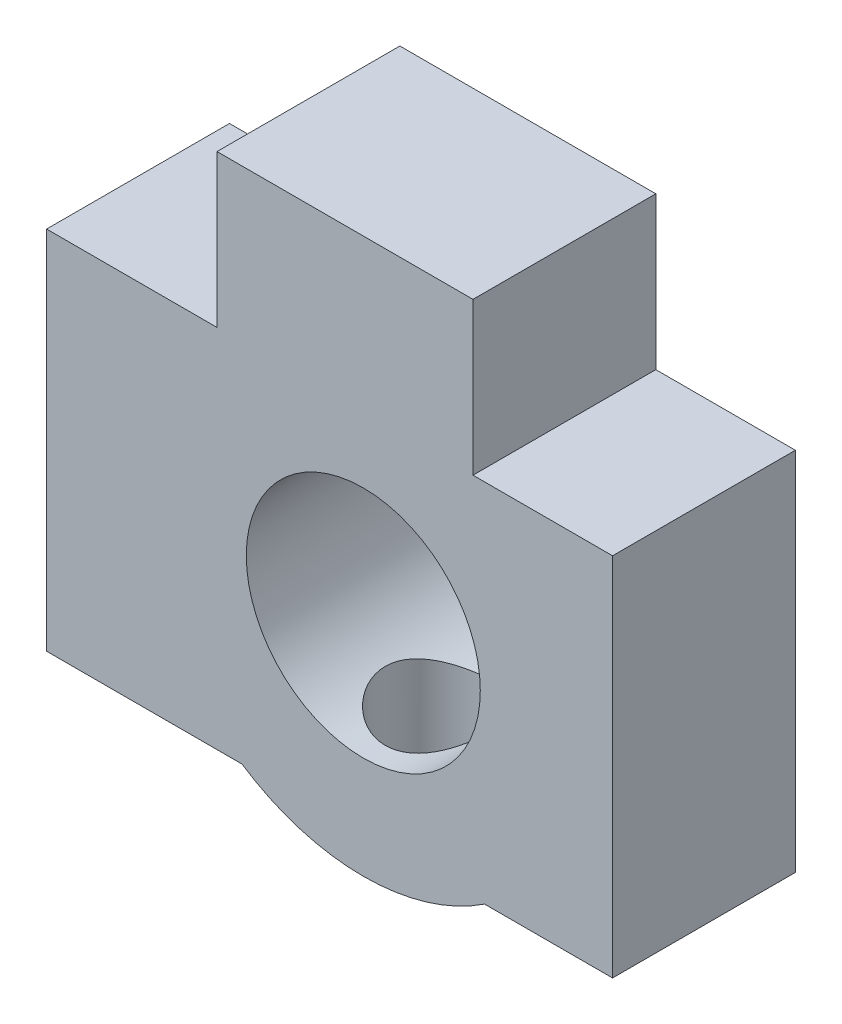
ISO-10303-21;
HEADER;
FILE_DESCRIPTION(('STEP AP214'),'2;1');
FILE_NAME('part.step','',(''),(''),'','','');
FILE_SCHEMA(('AUTOMOTIVE_DESIGN { 1 0 10303 214 1 1 1 1 }'));
ENDSEC;
DATA;
#1=APPLICATION_CONTEXT('core data for automotive mechanical design processes');
#2=APPLICATION_PROTOCOL_DEFINITION('international standard','automotive_design',2000,#1);
#3=PRODUCT_CONTEXT('',#1,'mechanical');
#4=PRODUCT('Part','Part','',(#3));
#5=PRODUCT_RELATED_PRODUCT_CATEGORY('part','',(#4));
#6=PRODUCT_DEFINITION_FORMATION('','',#4);
#7=PRODUCT_DEFINITION_CONTEXT('part definition',#1,'design');
#8=PRODUCT_DEFINITION('design','',#6,#7);
#9=PRODUCT_DEFINITION_SHAPE('','',#8);
#10=(LENGTH_UNIT() NAMED_UNIT(*) SI_UNIT(.MILLI.,.METRE.));
#11=(NAMED_UNIT(*) PLANE_ANGLE_UNIT() SI_UNIT($,.RADIAN.));
#12=(NAMED_UNIT(*) SI_UNIT($,.STERADIAN.) SOLID_ANGLE_UNIT());
#13=UNCERTAINTY_MEASURE_WITH_UNIT(LENGTH_MEASURE(1.E-05),#10,'distance_accuracy_value','');
#14=(GEOMETRIC_REPRESENTATION_CONTEXT(3) GLOBAL_UNCERTAINTY_ASSIGNED_CONTEXT((#13)) GLOBAL_UNIT_ASSIGNED_CONTEXT((#10,
#11,#12)) REPRESENTATION_CONTEXT('',''));
#15=CARTESIAN_POINT('',(0.,0.,0.));
#16=DIRECTION('',(0.,0.,1.));
#17=DIRECTION('',(1.,0.,0.));
#18=AXIS2_PLACEMENT_3D('',#15,#16,#17);
#19=CARTESIAN_POINT('',(0.,0.,5.));
#20=DIRECTION('',(0.,0.,-1.));
#21=DIRECTION('',(-1.,0.,0.));
#22=AXIS2_PLACEMENT_3D('',#19,#20,#21);
#23=CYLINDRICAL_SURFACE('',#22,6.);
#24=CARTESIAN_POINT('',(0.,0.,0.));
#25=DIRECTION('',(0.,0.,1.));
#26=DIRECTION('',(1.,0.,0.));
#27=AXIS2_PLACEMENT_3D('',#24,#25,#26);
#28=CIRCLE('',#27,6.);
#29=CARTESIAN_POINT('',(-3.31662479035541,-5.,0.));
#30=VERTEX_POINT('',#29);
#31=CARTESIAN_POINT('',(3.31662479035541,-5.,0.));
#32=VERTEX_POINT('',#31);
#33=EDGE_CURVE('E166',#30,#32,#28,.T.);
#34=ORIENTED_EDGE('',*,*,#33,.T.);
#35=DIRECTION('',(0.,0.,-1.));
#36=VECTOR('',#35,1.);
#37=CARTESIAN_POINT('',(3.31662479035541,-5.,5.));
#38=LINE('',#37,#36);
#39=CARTESIAN_POINT('',(3.31662479035541,-5.,5.));
#40=VERTEX_POINT('',#39);
#41=EDGE_CURVE('E11',#40,#32,#38,.T.);
#42=ORIENTED_EDGE('',*,*,#41,.F.);
#43=CARTESIAN_POINT('',(0.,0.,5.));
#44=DIRECTION('',(0.,0.,1.));
#45=DIRECTION('',(1.,0.,0.));
#46=AXIS2_PLACEMENT_3D('',#43,#44,#45);
#47=CIRCLE('',#46,6.);
#48=CARTESIAN_POINT('',(-3.31662479035541,-5.,5.));
#49=VERTEX_POINT('',#48);
#50=EDGE_CURVE('E195',#49,#40,#47,.T.);
#51=ORIENTED_EDGE('',*,*,#50,.F.);
#52=DIRECTION('',(0.,0.,-1.));
#53=VECTOR('',#52,1.);
#54=CARTESIAN_POINT('',(-3.31662479035541,-5.,5.));
#55=LINE('',#54,#53);
#56=EDGE_CURVE('E162',#49,#30,#55,.T.);
#57=ORIENTED_EDGE('',*,*,#56,.T.);
#58=EDGE_LOOP('',(#34,#42,#51,#57));
#59=FACE_BOUND('',#58,.T.);
#60=CARTESIAN_POINT('',(0.,-6.,4.4));
#61=CARTESIAN_POINT('',(-0.0828760886697312,-5.99999859868013,4.39999767426184));
#62=CARTESIAN_POINT('',(-0.165778157830763,-5.99826578131829,4.39310844922621));
#63=CARTESIAN_POINT('',(-0.329206323770533,-5.99152113829893,4.365774848693));
#64=CARTESIAN_POINT('',(-0.409731046870739,-5.98650745419969,4.34532279046215));
#65=CARTESIAN_POINT('',(-0.566020872182577,-5.9737562633204,4.29156074653791));
#66=CARTESIAN_POINT('',(-0.641791563430003,-5.96602202842087,4.25826620128472));
#67=CARTESIAN_POINT('',(-0.786672131904427,-5.94865343807593,4.17981860995517));
#68=CARTESIAN_POINT('',(-0.855781784348759,-5.93901901854051,4.13466516388106));
#69=CARTESIAN_POINT('',(-0.98680192730092,-5.91867413591802,4.03279921034579));
#70=CARTESIAN_POINT('',(-1.04855569006107,-5.90794707148533,3.97588842504082));
#71=CARTESIAN_POINT('',(-1.1617489272033,-5.8867362011753,3.85254779509108));
#72=CARTESIAN_POINT('',(-1.21318723694913,-5.87625242288349,3.7861168770535));
#73=CARTESIAN_POINT('',(-1.30502654279903,-5.85654775699711,3.64440477326256));
#74=CARTESIAN_POINT('',(-1.34525221592536,-5.84734794470605,3.5690067691896));
#75=CARTESIAN_POINT('',(-1.41239690855053,-5.83149494812223,3.41225158834164));
#76=CARTESIAN_POINT('',(-1.43931805543933,-5.82484135672789,3.33089536667424));
#77=CARTESIAN_POINT('',(-1.47855483680429,-5.81500476717551,3.16625650179753));
#78=CARTESIAN_POINT('',(-1.49115226833334,-5.81175491075426,3.0830451039502));
#79=CARTESIAN_POINT('',(-1.50226177506785,-5.80889362537741,2.91563143098602));
#80=CARTESIAN_POINT('',(-1.50077614181798,-5.80928160448644,2.83142931930139));
#81=CARTESIAN_POINT('',(-1.48398652463928,-5.81359205496618,2.66658419225552));
#82=CARTESIAN_POINT('',(-1.46901834019052,-5.81742863001879,2.5859043785349));
#83=CARTESIAN_POINT('',(-1.42622418690311,-5.82806709676484,2.42823894908871));
#84=CARTESIAN_POINT('',(-1.39839730206942,-5.83486919970697,2.35125359697102));
#85=CARTESIAN_POINT('',(-1.33038947793715,-5.85075113904187,2.20226198374793));
#86=CARTESIAN_POINT('',(-1.29008666723291,-5.85985327469421,2.13031382821045));
#87=CARTESIAN_POINT('',(-1.19835627601495,-5.87929710846386,1.99408129024316));
#88=CARTESIAN_POINT('',(-1.14692674880884,-5.88963902334736,1.92979825193274));
#89=CARTESIAN_POINT('',(-1.03266342468122,-5.91075880539781,1.8087963843056));
#90=CARTESIAN_POINT('',(-0.969546258165859,-5.92154069477972,1.75234550993865));
#91=CARTESIAN_POINT('',(-0.8346119175037,-5.94205965578786,1.6507787575361));
#92=CARTESIAN_POINT('',(-0.762794477707943,-5.95179669549416,1.60566322573643));
#93=CARTESIAN_POINT('',(-0.612115888681391,-5.96917732094183,1.52794941377561));
#94=CARTESIAN_POINT('',(-0.533231393208623,-5.97681360127725,1.49539465974557));
#95=CARTESIAN_POINT('',(-0.370876008142882,-5.98907916991419,1.44408269429043));
#96=CARTESIAN_POINT('',(-0.287405999150484,-5.99370903339281,1.42532284358186));
#97=CARTESIAN_POINT('',(-0.120539970390027,-5.99935499271375,1.40254243444116));
#98=CARTESIAN_POINT('',(-0.0371967199882099,-6.00046053508279,1.3981569739247));
#99=CARTESIAN_POINT('',(0.129032874801508,-5.99918804814451,1.40324900205549));
#100=CARTESIAN_POINT('',(0.211919259644595,-5.99681033241847,1.41272524279913));
#101=CARTESIAN_POINT('',(0.373614268776492,-5.98889581127357,1.44497090839138));
#102=CARTESIAN_POINT('',(0.452465118968755,-5.98340634185811,1.46754126347699));
#103=CARTESIAN_POINT('',(0.605257292452511,-5.96988706634134,1.52510708402845));
#104=CARTESIAN_POINT('',(0.679198119032635,-5.96185700369892,1.56010380431317));
#105=CARTESIAN_POINT('',(0.821523134429847,-5.94393307926311,1.64223612887473));
#106=CARTESIAN_POINT('',(0.88978544183583,-5.93400867366932,1.68957611239676));
#107=CARTESIAN_POINT('',(1.01752661364325,-5.91344509187419,1.79478990879697));
#108=CARTESIAN_POINT('',(1.07700395897301,-5.90280579251705,1.85266553961691));
#109=CARTESIAN_POINT('',(1.18699056807273,-5.88168956960771,1.97900196084446));
#110=CARTESIAN_POINT('',(1.23724386762203,-5.87122304187281,2.04768770300242));
#111=CARTESIAN_POINT('',(1.3255107590127,-5.85192878377239,2.19273263446572));
#112=CARTESIAN_POINT('',(1.36352489415794,-5.84310098067026,2.26909148295975));
#113=CARTESIAN_POINT('',(1.42595142060929,-5.82818094734665,2.42690572241308));
#114=CARTESIAN_POINT('',(1.45044439665407,-5.82207255291906,2.50832762834401));
#115=CARTESIAN_POINT('',(1.48534565995378,-5.81326744090184,2.67430963788911));
#116=CARTESIAN_POINT('',(1.49575702747866,-5.81056997719936,2.75886905103249));
#117=CARTESIAN_POINT('',(1.50203859033399,-5.80894901203957,2.9261210238552));
#118=CARTESIAN_POINT('',(1.49831789778012,-5.80991932728264,3.00879743512473));
#119=CARTESIAN_POINT('',(1.47737727831287,-5.81527909007843,3.17230388866798));
#120=CARTESIAN_POINT('',(1.46015762268677,-5.81966846891857,3.25313396801365));
#121=CARTESIAN_POINT('',(1.41293131944279,-5.83131260682723,3.41020845906541));
#122=CARTESIAN_POINT('',(1.38300140468038,-5.8385501523631,3.48647730524021));
#123=CARTESIAN_POINT('',(1.31126491360507,-5.85507755724829,3.63296538271369));
#124=CARTESIAN_POINT('',(1.26945669003419,-5.86436770120773,3.70318377318692));
#125=CARTESIAN_POINT('',(1.17386774863714,-5.88425634263512,3.83755462900202));
#126=CARTESIAN_POINT('',(1.11980316291225,-5.89488264831757,3.90150107342396));
#127=CARTESIAN_POINT('',(1.00178937118974,-5.91608027246286,4.01954704479541));
#128=CARTESIAN_POINT('',(0.937837821261146,-5.9266515772706,4.07364423011297));
#129=CARTESIAN_POINT('',(0.80046758670259,-5.94677655647663,4.17141130856461));
#130=CARTESIAN_POINT('',(0.726898422316387,-5.95630833365868,4.21487461367158));
#131=CARTESIAN_POINT('',(0.573266059510476,-5.97304924975119,4.28874746294053));
#132=CARTESIAN_POINT('',(0.49320756343674,-5.98026005199782,4.31916636064854));
#133=CARTESIAN_POINT('',(0.344410253243472,-5.99048059565542,4.36157183032965));
#134=CARTESIAN_POINT('',(0.276380170908068,-5.99402585052691,4.37595124305343));
#135=CARTESIAN_POINT('',(0.138906071536283,-5.99878605231949,4.39516594362194));
#136=CARTESIAN_POINT('',(0.0694621612426163,-6.00000117450894,4.4000019493053));
#137=CARTESIAN_POINT('',(0.,-6.,4.4));
#138=B_SPLINE_CURVE_WITH_KNOTS('',3,(#60,#61,#62,#63,#64,#65,#66,#67,#68,#69,#70,#71,#72,#73,
#74,#75,#76,#77,#78,#79,#80,#81,#82,#83,#84,#85,#86,#87,#88,#89,#90,#91,#92,#93,#94,#95,#96,#97,
#98,#99,#100,#101,#102,#103,#104,#105,#106,#107,#108,#109,#110,#111,#112,#113,#114,#115,#116,
#117,#118,#119,#120,#121,#122,#123,#124,#125,#126,#127,#128,#129,#130,#131,#132,#133,#134,#135,
#136,#137),.UNSPECIFIED.,.T.,.F.,(4,2,2,2,2,2,2,2,2,2,2,2,2,2,2,2,2,2,2,2,2,2,2,2,2,2,2,2,2,2,2,
2,2,2,2,2,2,2,4),(0.,0.24837371247189,0.4968882377639,0.745104902286106,0.993329940169328,
1.24614435437139,1.49898729580062,1.75558647545807,2.01214461169368,2.2635629509943,
2.51494038112697,2.76022497007018,3.00552703466038,3.25330527873879,3.50112690836163,
3.75601500969019,4.01091089558247,4.26668229009114,4.52240473688643,4.77158308949276,
5.02073901112743,5.26620274514037,5.5116912732229,5.76153587565352,6.01142363008019,
6.26744509204476,6.52345518749508,6.77792254614036,7.03233423252408,7.27943780398613,
7.52653640956034,7.77216400559447,8.01782568136901,8.2698957640991,8.52202569770418,
8.77872185499588,9.0352336382135,9.24342242942149,9.4515955604304),.UNSPECIFIED.);
#139=CARTESIAN_POINT('',(0.,-6.,4.4));
#140=VERTEX_POINT('',#139);
#141=EDGE_CURVE('E263',#140,#140,#138,.T.);
#142=ORIENTED_EDGE('',*,*,#141,.F.);
#143=EDGE_LOOP('',(#142));
#144=FACE_BOUND('',#143,.T.);
#145=ADVANCED_FACE('F45',(#59,#144),#23,.T.);
#146=CARTESIAN_POINT('',(0.,0.,5.));
#147=DIRECTION('',(0.,0.,-1.));
#148=DIRECTION('',(-1.,0.,0.));
#149=AXIS2_PLACEMENT_3D('',#146,#147,#148);
#150=CYLINDRICAL_SURFACE('',#149,3.2);
#151=CARTESIAN_POINT('',(0.,0.,0.));
#152=DIRECTION('',(0.,0.,1.));
#153=DIRECTION('',(1.,0.,0.));
#154=AXIS2_PLACEMENT_3D('',#151,#152,#153);
#155=CIRCLE('',#154,3.2);
#156=CARTESIAN_POINT('',(3.2,0.,0.));
#157=VERTEX_POINT('',#156);
#158=EDGE_CURVE('E259',#157,#157,#155,.T.);
#159=ORIENTED_EDGE('',*,*,#158,.F.);
#160=EDGE_LOOP('',(#159));
#161=FACE_BOUND('',#160,.T.);
#162=CARTESIAN_POINT('',(0.,0.,5.));
#163=DIRECTION('',(0.,0.,1.));
#164=DIRECTION('',(1.,0.,0.));
#165=AXIS2_PLACEMENT_3D('',#162,#163,#164);
#166=CIRCLE('',#165,3.2);
#167=CARTESIAN_POINT('',(3.2,0.,5.));
#168=VERTEX_POINT('',#167);
#169=EDGE_CURVE('E171',#168,#168,#166,.T.);
#170=ORIENTED_EDGE('',*,*,#169,.T.);
#171=EDGE_LOOP('',(#170));
#172=FACE_BOUND('',#171,.T.);
#173=CARTESIAN_POINT('',(0.,-3.2,4.4));
#174=CARTESIAN_POINT('',(-0.0794366297653682,-3.19999630571425,4.39999561058292));
#175=CARTESIAN_POINT('',(-0.158985054285573,-3.19700957899868,4.39365264329253));
#176=CARTESIAN_POINT('',(-0.315767144342182,-3.18535757334793,4.36854425165927));
#177=CARTESIAN_POINT('',(-0.392995334806226,-3.17667982118131,4.34975153982898));
#178=CARTESIAN_POINT('',(-0.542623613933924,-3.15456154654934,4.30061988806623));
#179=CARTESIAN_POINT('',(-0.615040476822121,-3.14113872828529,4.2703238372491));
#180=CARTESIAN_POINT('',(-0.75367331655017,-3.11079077785621,4.19924963990224));
#181=CARTESIAN_POINT('',(-0.819890295729099,-3.09386621324576,4.15847319175087));
#182=CARTESIAN_POINT('',(-0.948350357177736,-3.0570148530726,4.06502492776082));
#183=CARTESIAN_POINT('',(-1.01017369872327,-3.03697404361316,4.01182164329567));
#184=CARTESIAN_POINT('',(-1.12439785354931,-2.99656590387074,3.89616419530445));
#185=CARTESIAN_POINT('',(-1.17679240559473,-2.97619836632648,3.83370393446304));
#186=CARTESIAN_POINT('',(-1.27411857201607,-2.93591183357015,3.69634340712206));
#187=CARTESIAN_POINT('',(-1.31833010930722,-2.91611100881908,3.62089438374643));
#188=CARTESIAN_POINT('',(-1.39325151163875,-2.88107150479241,3.46258725941297));
#189=CARTESIAN_POINT('',(-1.4239700636606,-2.86582989225174,3.37973396690999));
#190=CARTESIAN_POINT('',(-1.46919263785962,-2.84290120635756,3.21376127942807));
#191=CARTESIAN_POINT('',(-1.48450988794257,-2.83483816808474,3.13091777215292));
#192=CARTESIAN_POINT('',(-1.50101060360856,-2.82613943112327,2.96347552662614));
#193=CARTESIAN_POINT('',(-1.50220525058387,-2.82549785659326,2.87887823008684));
#194=CARTESIAN_POINT('',(-1.49102860152934,-2.83140540410836,2.71957237471766));
#195=CARTESIAN_POINT('',(-1.48002746065053,-2.83722835518323,2.64473468389049));
#196=CARTESIAN_POINT('',(-1.44711565103969,-2.85415400915747,2.49812514469236));
#197=CARTESIAN_POINT('',(-1.42520214213451,-2.86525808654715,2.4263540997636));
#198=CARTESIAN_POINT('',(-1.37065958454468,-2.89175132581127,2.28591415221089));
#199=CARTESIAN_POINT('',(-1.33779469146436,-2.90723355127044,2.21735521257221));
#200=CARTESIAN_POINT('',(-1.26245573982023,-2.94073170962085,2.08641696408398));
#201=CARTESIAN_POINT('',(-1.21997747050552,-2.95874875147367,2.02404038043298));
#202=CARTESIAN_POINT('',(-1.12117144504836,-2.99768064068318,1.90003603489787));
#203=CARTESIAN_POINT('',(-1.06383576537821,-3.01869659998739,1.83924049772551));
#204=CARTESIAN_POINT('',(-0.939641687550932,-3.05963196112561,1.7278067269063));
#205=CARTESIAN_POINT('',(-0.872779758723928,-3.07955095258331,1.67717227604927));
#206=CARTESIAN_POINT('',(-0.728323977918189,-3.11693783151282,1.58580670678833));
#207=CARTESIAN_POINT('',(-0.650429064841609,-3.13429076469825,1.54550086650323));
#208=CARTESIAN_POINT('',(-0.487942227794179,-3.16365420400246,1.47887112910029));
#209=CARTESIAN_POINT('',(-0.403355047372973,-3.1756684549702,1.45253742862182));
#210=CARTESIAN_POINT('',(-0.236758036703878,-3.19224313378799,1.41654123334738));
#211=CARTESIAN_POINT('',(-0.155037856315182,-3.19729898462949,1.40576759698721));
#212=CARTESIAN_POINT('',(0.00919528809397378,-3.20103907716323,1.39777950822713));
#213=CARTESIAN_POINT('',(0.0917079278381503,-3.199725822791,1.40055972729755));
#214=CARTESIAN_POINT('',(0.24939802481789,-3.19117976213987,1.41889078863891));
#215=CARTESIAN_POINT('',(0.324699508933727,-3.18434450990737,1.43358419440894));
#216=CARTESIAN_POINT('',(0.471643871417133,-3.16591825802244,1.47404010019741));
#217=CARTESIAN_POINT('',(0.543286322002911,-3.15432670372993,1.49980389116791));
#218=CARTESIAN_POINT('',(0.683383574707803,-3.12701756569302,1.56244402659857));
#219=CARTESIAN_POINT('',(0.751674047016101,-3.11118471264979,1.59963591888514));
#220=CARTESIAN_POINT('',(0.88128616247221,-3.07698472270414,1.68373121963596));
#221=CARTESIAN_POINT('',(0.94260472604946,-3.05861647375887,1.73063889405607));
#222=CARTESIAN_POINT('',(1.06226746295268,-3.01925452981606,1.83765018660463));
#223=CARTESIAN_POINT('',(1.11986840035393,-2.99817233580377,1.89855416111092));
#224=CARTESIAN_POINT('',(1.22431969123982,-2.95705916335382,2.02933948650308));
#225=CARTESIAN_POINT('',(1.27116477824616,-2.93702870357223,2.09922520918879));
#226=CARTESIAN_POINT('',(1.35418065576862,-2.89971388021076,2.24902795724821));
#227=CARTESIAN_POINT('',(1.38994353105744,-2.88254332558056,2.32920173008557));
#228=CARTESIAN_POINT('',(1.4470971383464,-2.85428508393637,2.49550329812211));
#229=CARTESIAN_POINT('',(1.46850394342155,-2.84319059671076,2.5816243151755));
#230=CARTESIAN_POINT('',(1.49455896187422,-2.82957416856734,2.74899059542077));
#231=CARTESIAN_POINT('',(1.50054972888926,-2.82636665307332,2.82997073958799));
#232=CARTESIAN_POINT('',(1.49937130319663,-2.82699286139304,2.99179630828293));
#233=CARTESIAN_POINT('',(1.49220590575928,-2.83082455454675,3.07264176493122));
#234=CARTESIAN_POINT('',(1.46613131656595,-2.84440619852351,3.22563030531754));
#235=CARTESIAN_POINT('',(1.44813274734754,-2.85369602866639,3.2979740549795));
#236=CARTESIAN_POINT('',(1.40193210541393,-2.87667309849877,3.43857831254803));
#237=CARTESIAN_POINT('',(1.37372698279688,-2.89036165246904,3.50683759282916));
#238=CARTESIAN_POINT('',(1.30578840174151,-2.92171219398703,3.64231816788488));
#239=CARTESIAN_POINT('',(1.26541393094301,-2.93957763369423,3.70916973579331));
#240=CARTESIAN_POINT('',(1.17505974072646,-2.97684766005847,3.83556183749781));
#241=CARTESIAN_POINT('',(1.12507549698614,-2.99625296915541,3.89509890587003));
#242=CARTESIAN_POINT('',(1.01093776241371,-3.03677948258486,4.01144065398378));
#243=CARTESIAN_POINT('',(0.945860595498028,-3.05787468390215,4.06735297827197));
#244=CARTESIAN_POINT('',(0.806562992145148,-3.09753038570267,4.16760319507513));
#245=CARTESIAN_POINT('',(0.732338206421693,-3.11608967155914,4.21193555033864));
#246=CARTESIAN_POINT('',(0.576903485633843,-3.14856405697806,4.28730255460567));
#247=CARTESIAN_POINT('',(0.495727955804571,-3.16250053665866,4.31839861522038));
#248=CARTESIAN_POINT('',(0.328585281775293,-3.18419214255065,4.36613044556899));
#249=CARTESIAN_POINT('',(0.242633177608918,-3.19196561184219,4.38280913945753));
#250=CARTESIAN_POINT('',(0.129990114749172,-3.19746509257475,4.39458506732442));
#251=CARTESIAN_POINT('',(0.104046547063508,-3.19841374704826,4.39661342256158));
#252=CARTESIAN_POINT('',(0.0520726592552661,-3.19968181283614,4.39932162236327));
#253=CARTESIAN_POINT('',(0.0260423373483132,-3.20000121112686,4.40000143901725));
#254=CARTESIAN_POINT('',(0.,-3.2,4.4));
#255=B_SPLINE_CURVE_WITH_KNOTS('',3,(#173,#174,#175,#176,#177,#178,#179,#180,#181,#182,#183,
#184,#185,#186,#187,#188,#189,#190,#191,#192,#193,#194,#195,#196,#197,#198,#199,#200,#201,#202,
#203,#204,#205,#206,#207,#208,#209,#210,#211,#212,#213,#214,#215,#216,#217,#218,#219,#220,#221,
#222,#223,#224,#225,#226,#227,#228,#229,#230,#231,#232,#233,#234,#235,#236,#237,#238,#239,#240,
#241,#242,#243,#244,#245,#246,#247,#248,#249,#250,#251,#252,#253,#254),.UNSPECIFIED.,.T.,.F.,(4,
2,2,2,2,2,2,2,2,2,2,2,2,2,2,2,2,2,2,2,2,2,2,2,2,2,2,2,2,2,2,2,2,2,2,2,2,2,2,2,4),(0.,
0.238203501088987,0.476930834285988,0.714776698722001,0.952584043830979,1.20348916300413,
1.45456028706044,1.72218974999842,1.98964665571214,2.24209356207648,2.49434058339923,
2.72088002998001,2.94747846905439,3.17931153510989,3.41124634347932,3.66861529673091,
3.92607988679166,4.1928727405001,4.45947815428198,4.70590077523508,4.95222652601424,
5.18224856612757,5.41229743710968,5.64937682702354,5.88656053405105,6.14473054024122,
6.40302668810358,6.66993374182532,6.93654146493569,7.17899577047639,7.4213801441569,
7.64578370611674,7.87025437934697,8.1096266208682,8.34911183707249,8.6129314932358,
8.87687707137173,9.13958432454604,9.40150671085486,9.47959722860009,9.55768936255934),.UNSPECIFIED.);
#256=CARTESIAN_POINT('',(0.,-3.2,4.4));
#257=VERTEX_POINT('',#256);
#258=EDGE_CURVE('E49',#257,#257,#255,.T.);
#259=ORIENTED_EDGE('',*,*,#258,.T.);
#260=EDGE_LOOP('',(#259));
#261=FACE_BOUND('',#260,.T.);
#262=ADVANCED_FACE('F277',(#161,#172,#261),#150,.F.);
#263=CARTESIAN_POINT('',(0.,0.,5.));
#264=DIRECTION('',(0.,0.,1.));
#265=DIRECTION('',(1.,0.,0.));
#266=AXIS2_PLACEMENT_3D('',#263,#264,#265);
#267=PLANE('',#266);
#268=ORIENTED_EDGE('',*,*,#50,.T.);
#269=DIRECTION('',(1.,0.,0.));
#270=VECTOR('',#269,1.);
#271=CARTESIAN_POINT('',(3.31662479035541,-5.,5.));
#272=LINE('',#271,#270);
#273=CARTESIAN_POINT('',(6.8166247903554,-5.,5.));
#274=VERTEX_POINT('',#273);
#275=EDGE_CURVE('E118',#40,#274,#272,.T.);
#276=ORIENTED_EDGE('',*,*,#275,.T.);
#277=DIRECTION('',(0.,1.,0.));
#278=VECTOR('',#277,1.);
#279=CARTESIAN_POINT('',(6.8166247903554,-5.,5.));
#280=LINE('',#279,#278);
#281=CARTESIAN_POINT('',(6.8166247903554,5.,5.));
#282=VERTEX_POINT('',#281);
#283=EDGE_CURVE('E225',#274,#282,#280,.T.);
#284=ORIENTED_EDGE('',*,*,#283,.T.);
#285=DIRECTION('',(-1.,0.,0.));
#286=VECTOR('',#285,1.);
#287=CARTESIAN_POINT('',(6.8166247903554,5.,5.));
#288=LINE('',#287,#286);
#289=CARTESIAN_POINT('',(3.,5.,5.));
#290=VERTEX_POINT('',#289);
#291=EDGE_CURVE('E245',#282,#290,#288,.T.);
#292=ORIENTED_EDGE('',*,*,#291,.T.);
#293=DIRECTION('',(0.,1.,0.));
#294=VECTOR('',#293,1.);
#295=CARTESIAN_POINT('',(3.,5.,5.));
#296=LINE('',#295,#294);
#297=CARTESIAN_POINT('',(3.,9.16515138991168,5.));
#298=VERTEX_POINT('',#297);
#299=EDGE_CURVE('E241',#290,#298,#296,.T.);
#300=ORIENTED_EDGE('',*,*,#299,.T.);
#301=DIRECTION('',(-1.,0.,0.));
#302=VECTOR('',#301,1.);
#303=CARTESIAN_POINT('',(3.,9.16515138991168,5.));
#304=LINE('',#303,#302);
#305=CARTESIAN_POINT('',(-4.,9.16515138991168,5.));
#306=VERTEX_POINT('',#305);
#307=EDGE_CURVE('E244',#298,#306,#304,.T.);
#308=ORIENTED_EDGE('',*,*,#307,.T.);
#309=DIRECTION('',(0.,-1.,0.));
#310=VECTOR('',#309,1.);
#311=CARTESIAN_POINT('',(-4.,5.,5.));
#312=LINE('',#311,#310);
#313=CARTESIAN_POINT('',(-4.,5.,5.));
#314=VERTEX_POINT('',#313);
#315=EDGE_CURVE('E144',#306,#314,#312,.T.);
#316=ORIENTED_EDGE('',*,*,#315,.T.);
#317=DIRECTION('',(-1.,0.,0.));
#318=VECTOR('',#317,1.);
#319=CARTESIAN_POINT('',(-4.,5.,5.));
#320=LINE('',#319,#318);
#321=CARTESIAN_POINT('',(-8.66025403784439,5.,5.));
#322=VERTEX_POINT('',#321);
#323=EDGE_CURVE('E137',#314,#322,#320,.T.);
#324=ORIENTED_EDGE('',*,*,#323,.T.);
#325=DIRECTION('',(0.,-1.,0.));
#326=VECTOR('',#325,1.);
#327=CARTESIAN_POINT('',(-8.66025403784439,-5.,5.));
#328=LINE('',#327,#326);
#329=CARTESIAN_POINT('',(-8.66025403784439,-5.,5.));
#330=VERTEX_POINT('',#329);
#331=EDGE_CURVE('E142',#322,#330,#328,.T.);
#332=ORIENTED_EDGE('',*,*,#331,.T.);
#333=DIRECTION('',(1.,0.,0.));
#334=VECTOR('',#333,1.);
#335=CARTESIAN_POINT('',(-3.31662479035541,-5.,5.));
#336=LINE('',#335,#334);
#337=EDGE_CURVE('E69',#330,#49,#336,.T.);
#338=ORIENTED_EDGE('',*,*,#337,.T.);
#339=EDGE_LOOP('',(#268,#276,#284,#292,#300,#308,#316,#324,#332,#338));
#340=FACE_BOUND('',#339,.T.);
#341=ORIENTED_EDGE('',*,*,#169,.F.);
#342=EDGE_LOOP('',(#341));
#343=FACE_BOUND('',#342,.T.);
#344=ADVANCED_FACE('F139',(#340,#343),#267,.T.);
#345=CARTESIAN_POINT('',(0.,0.,0.));
#346=DIRECTION('',(0.,0.,1.));
#347=DIRECTION('',(1.,0.,0.));
#348=AXIS2_PLACEMENT_3D('',#345,#346,#347);
#349=PLANE('',#348);
#350=ORIENTED_EDGE('',*,*,#33,.F.);
#351=DIRECTION('',(1.,0.,0.));
#352=VECTOR('',#351,1.);
#353=CARTESIAN_POINT('',(-3.31662479035541,-5.,0.));
#354=LINE('',#353,#352);
#355=CARTESIAN_POINT('',(-8.66025403784439,-5.,0.));
#356=VERTEX_POINT('',#355);
#357=EDGE_CURVE('E110',#356,#30,#354,.T.);
#358=ORIENTED_EDGE('',*,*,#357,.F.);
#359=DIRECTION('',(0.,-1.,0.));
#360=VECTOR('',#359,1.);
#361=CARTESIAN_POINT('',(-8.66025403784439,-5.,0.));
#362=LINE('',#361,#360);
#363=CARTESIAN_POINT('',(-8.66025403784439,5.,0.));
#364=VERTEX_POINT('',#363);
#365=EDGE_CURVE('E104',#364,#356,#362,.T.);
#366=ORIENTED_EDGE('',*,*,#365,.F.);
#367=DIRECTION('',(-1.,0.,0.));
#368=VECTOR('',#367,1.);
#369=CARTESIAN_POINT('',(-4.,5.,0.));
#370=LINE('',#369,#368);
#371=CARTESIAN_POINT('',(-4.,5.,0.));
#372=VERTEX_POINT('',#371);
#373=EDGE_CURVE('E153',#372,#364,#370,.T.);
#374=ORIENTED_EDGE('',*,*,#373,.F.);
#375=DIRECTION('',(0.,-1.,0.));
#376=VECTOR('',#375,1.);
#377=CARTESIAN_POINT('',(-4.,5.,0.));
#378=LINE('',#377,#376);
#379=CARTESIAN_POINT('',(-4.,9.16515138991168,0.));
#380=VERTEX_POINT('',#379);
#381=EDGE_CURVE('E186',#380,#372,#378,.T.);
#382=ORIENTED_EDGE('',*,*,#381,.F.);
#383=DIRECTION('',(-1.,0.,0.));
#384=VECTOR('',#383,1.);
#385=CARTESIAN_POINT('',(3.,9.16515138991168,0.));
#386=LINE('',#385,#384);
#387=CARTESIAN_POINT('',(3.,9.16515138991168,0.));
#388=VERTEX_POINT('',#387);
#389=EDGE_CURVE('E183',#388,#380,#386,.T.);
#390=ORIENTED_EDGE('',*,*,#389,.F.);
#391=DIRECTION('',(0.,1.,0.));
#392=VECTOR('',#391,1.);
#393=CARTESIAN_POINT('',(3.,5.,0.));
#394=LINE('',#393,#392);
#395=CARTESIAN_POINT('',(3.,5.,0.));
#396=VERTEX_POINT('',#395);
#397=EDGE_CURVE('E180',#396,#388,#394,.T.);
#398=ORIENTED_EDGE('',*,*,#397,.F.);
#399=DIRECTION('',(-1.,0.,0.));
#400=VECTOR('',#399,1.);
#401=CARTESIAN_POINT('',(6.8166247903554,5.,0.));
#402=LINE('',#401,#400);
#403=CARTESIAN_POINT('',(6.8166247903554,5.,0.));
#404=VERTEX_POINT('',#403);
#405=EDGE_CURVE('E177',#404,#396,#402,.T.);
#406=ORIENTED_EDGE('',*,*,#405,.F.);
#407=DIRECTION('',(0.,1.,0.));
#408=VECTOR('',#407,1.);
#409=CARTESIAN_POINT('',(6.8166247903554,-5.,0.));
#410=LINE('',#409,#408);
#411=CARTESIAN_POINT('',(6.8166247903554,-5.,0.));
#412=VERTEX_POINT('',#411);
#413=EDGE_CURVE('E174',#412,#404,#410,.T.);
#414=ORIENTED_EDGE('',*,*,#413,.F.);
#415=DIRECTION('',(1.,0.,0.));
#416=VECTOR('',#415,1.);
#417=CARTESIAN_POINT('',(3.31662479035541,-5.,0.));
#418=LINE('',#417,#416);
#419=EDGE_CURVE('E170',#32,#412,#418,.T.);
#420=ORIENTED_EDGE('',*,*,#419,.F.);
#421=EDGE_LOOP('',(#350,#358,#366,#374,#382,#390,#398,#406,#414,#420));
#422=FACE_BOUND('',#421,.T.);
#423=ORIENTED_EDGE('',*,*,#158,.T.);
#424=EDGE_LOOP('',(#423));
#425=FACE_BOUND('',#424,.T.);
#426=ADVANCED_FACE('F229',(#422,#425),#349,.F.);
#427=CARTESIAN_POINT('',(3.31662479035541,-5.,5.));
#428=DIRECTION('',(0.,1.,0.));
#429=DIRECTION('',(0.,0.,1.));
#430=AXIS2_PLACEMENT_3D('',#427,#428,#429);
#431=PLANE('',#430);
#432=ORIENTED_EDGE('',*,*,#419,.T.);
#433=DIRECTION('',(0.,0.,-1.));
#434=VECTOR('',#433,1.);
#435=CARTESIAN_POINT('',(6.8166247903554,-5.,5.));
#436=LINE('',#435,#434);
#437=EDGE_CURVE('E61',#274,#412,#436,.T.);
#438=ORIENTED_EDGE('',*,*,#437,.F.);
#439=ORIENTED_EDGE('',*,*,#275,.F.);
#440=ORIENTED_EDGE('',*,*,#41,.T.);
#441=EDGE_LOOP('',(#432,#438,#439,#440));
#442=FACE_BOUND('',#441,.T.);
#443=ADVANCED_FACE('F287',(#442),#431,.F.);
#444=CARTESIAN_POINT('',(6.8166247903554,-5.,5.));
#445=DIRECTION('',(-1.,0.,0.));
#446=DIRECTION('',(0.,0.,1.));
#447=AXIS2_PLACEMENT_3D('',#444,#445,#446);
#448=PLANE('',#447);
#449=ORIENTED_EDGE('',*,*,#413,.T.);
#450=DIRECTION('',(0.,0.,-1.));
#451=VECTOR('',#450,1.);
#452=CARTESIAN_POINT('',(6.8166247903554,5.,5.));
#453=LINE('',#452,#451);
#454=EDGE_CURVE('E214',#282,#404,#453,.T.);
#455=ORIENTED_EDGE('',*,*,#454,.F.);
#456=ORIENTED_EDGE('',*,*,#283,.F.);
#457=ORIENTED_EDGE('',*,*,#437,.T.);
#458=EDGE_LOOP('',(#449,#455,#456,#457));
#459=FACE_BOUND('',#458,.T.);
#460=ADVANCED_FACE('F223',(#459),#448,.F.);
#461=CARTESIAN_POINT('',(6.8166247903554,5.,5.));
#462=DIRECTION('',(0.,-1.,0.));
#463=DIRECTION('',(1.,0.,0.));
#464=AXIS2_PLACEMENT_3D('',#461,#462,#463);
#465=PLANE('',#464);
#466=ORIENTED_EDGE('',*,*,#405,.T.);
#467=DIRECTION('',(0.,0.,-1.));
#468=VECTOR('',#467,1.);
#469=CARTESIAN_POINT('',(3.,5.,5.));
#470=LINE('',#469,#468);
#471=EDGE_CURVE('E210',#290,#396,#470,.T.);
#472=ORIENTED_EDGE('',*,*,#471,.F.);
#473=ORIENTED_EDGE('',*,*,#291,.F.);
#474=ORIENTED_EDGE('',*,*,#454,.T.);
#475=EDGE_LOOP('',(#466,#472,#473,#474));
#476=FACE_BOUND('',#475,.T.);
#477=ADVANCED_FACE('F235',(#476),#465,.F.);
#478=CARTESIAN_POINT('',(3.,5.,5.));
#479=DIRECTION('',(-1.,0.,0.));
#480=DIRECTION('',(0.,0.,1.));
#481=AXIS2_PLACEMENT_3D('',#478,#479,#480);
#482=PLANE('',#481);
#483=ORIENTED_EDGE('',*,*,#397,.T.);
#484=DIRECTION('',(0.,0.,-1.));
#485=VECTOR('',#484,1.);
#486=CARTESIAN_POINT('',(3.,9.16515138991168,5.));
#487=LINE('',#486,#485);
#488=EDGE_CURVE('E206',#298,#388,#487,.T.);
#489=ORIENTED_EDGE('',*,*,#488,.F.);
#490=ORIENTED_EDGE('',*,*,#299,.F.);
#491=ORIENTED_EDGE('',*,*,#471,.T.);
#492=EDGE_LOOP('',(#483,#489,#490,#491));
#493=FACE_BOUND('',#492,.T.);
#494=ADVANCED_FACE('F239',(#493),#482,.F.);
#495=CARTESIAN_POINT('',(3.,9.16515138991168,5.));
#496=DIRECTION('',(0.,-1.,0.));
#497=DIRECTION('',(0.,0.,-1.));
#498=AXIS2_PLACEMENT_3D('',#495,#496,#497);
#499=PLANE('',#498);
#500=ORIENTED_EDGE('',*,*,#389,.T.);
#501=DIRECTION('',(0.,0.,-1.));
#502=VECTOR('',#501,1.);
#503=CARTESIAN_POINT('',(-4.,9.16515138991168,5.));
#504=LINE('',#503,#502);
#505=EDGE_CURVE('E202',#306,#380,#504,.T.);
#506=ORIENTED_EDGE('',*,*,#505,.F.);
#507=ORIENTED_EDGE('',*,*,#307,.F.);
#508=ORIENTED_EDGE('',*,*,#488,.T.);
#509=EDGE_LOOP('',(#500,#506,#507,#508));
#510=FACE_BOUND('',#509,.T.);
#511=ADVANCED_FACE('F297',(#510),#499,.F.);
#512=CARTESIAN_POINT('',(-4.,5.,5.));
#513=DIRECTION('',(1.,0.,0.));
#514=DIRECTION('',(0.,0.,-1.));
#515=AXIS2_PLACEMENT_3D('',#512,#513,#514);
#516=PLANE('',#515);
#517=ORIENTED_EDGE('',*,*,#381,.T.);
#518=DIRECTION('',(0.,0.,-1.));
#519=VECTOR('',#518,1.);
#520=CARTESIAN_POINT('',(-4.,5.,5.));
#521=LINE('',#520,#519);
#522=EDGE_CURVE('E155',#314,#372,#521,.T.);
#523=ORIENTED_EDGE('',*,*,#522,.F.);
#524=ORIENTED_EDGE('',*,*,#315,.F.);
#525=ORIENTED_EDGE('',*,*,#505,.T.);
#526=EDGE_LOOP('',(#517,#523,#524,#525));
#527=FACE_BOUND('',#526,.T.);
#528=ADVANCED_FACE('F294',(#527),#516,.F.);
#529=CARTESIAN_POINT('',(-4.,5.,5.));
#530=DIRECTION('',(0.,-1.,0.));
#531=DIRECTION('',(0.,0.,-1.));
#532=AXIS2_PLACEMENT_3D('',#529,#530,#531);
#533=PLANE('',#532);
#534=ORIENTED_EDGE('',*,*,#373,.T.);
#535=DIRECTION('',(0.,0.,-1.));
#536=VECTOR('',#535,1.);
#537=CARTESIAN_POINT('',(-8.66025403784439,5.,5.));
#538=LINE('',#537,#536);
#539=EDGE_CURVE('E150',#322,#364,#538,.T.);
#540=ORIENTED_EDGE('',*,*,#539,.F.);
#541=ORIENTED_EDGE('',*,*,#323,.F.);
#542=ORIENTED_EDGE('',*,*,#522,.T.);
#543=EDGE_LOOP('',(#534,#540,#541,#542));
#544=FACE_BOUND('',#543,.T.);
#545=ADVANCED_FACE('F151',(#544),#533,.F.);
#546=CARTESIAN_POINT('',(-8.66025403784439,-5.,5.));
#547=DIRECTION('',(1.,0.,0.));
#548=DIRECTION('',(0.,0.,-1.));
#549=AXIS2_PLACEMENT_3D('',#546,#547,#548);
#550=PLANE('',#549);
#551=ORIENTED_EDGE('',*,*,#365,.T.);
#552=DIRECTION('',(0.,0.,-1.));
#553=VECTOR('',#552,1.);
#554=CARTESIAN_POINT('',(-8.66025403784439,-5.,5.));
#555=LINE('',#554,#553);
#556=EDGE_CURVE('E156',#330,#356,#555,.T.);
#557=ORIENTED_EDGE('',*,*,#556,.F.);
#558=ORIENTED_EDGE('',*,*,#331,.F.);
#559=ORIENTED_EDGE('',*,*,#539,.T.);
#560=EDGE_LOOP('',(#551,#557,#558,#559));
#561=FACE_BOUND('',#560,.T.);
#562=ADVANCED_FACE('F158',(#561),#550,.F.);
#563=CARTESIAN_POINT('',(-3.31662479035541,-5.,5.));
#564=DIRECTION('',(0.,1.,0.));
#565=DIRECTION('',(0.,0.,1.));
#566=AXIS2_PLACEMENT_3D('',#563,#564,#565);
#567=PLANE('',#566);
#568=ORIENTED_EDGE('',*,*,#357,.T.);
#569=ORIENTED_EDGE('',*,*,#56,.F.);
#570=ORIENTED_EDGE('',*,*,#337,.F.);
#571=ORIENTED_EDGE('',*,*,#556,.T.);
#572=EDGE_LOOP('',(#568,#569,#570,#571));
#573=FACE_BOUND('',#572,.T.);
#574=ADVANCED_FACE('F275',(#573),#567,.F.);
#575=CARTESIAN_POINT('',(0.,-10.,2.9));
#576=DIRECTION('',(0.,1.,0.));
#577=DIRECTION('',(0.,0.,1.));
#578=AXIS2_PLACEMENT_3D('',#575,#576,#577);
#579=CYLINDRICAL_SURFACE('',#578,1.5);
#580=ORIENTED_EDGE('',*,*,#258,.F.);
#581=EDGE_LOOP('',(#580));
#582=FACE_BOUND('',#581,.T.);
#583=ORIENTED_EDGE('',*,*,#141,.T.);
#584=EDGE_LOOP('',(#583));
#585=FACE_BOUND('',#584,.T.);
#586=ADVANCED_FACE('F272',(#582,#585),#579,.F.);
#587=CLOSED_SHELL('',(#145,#262,#344,#426,#443,#460,#477,#494,#511,#528,#545,#562,#574,#586));
#588=MANIFOLD_SOLID_BREP('B2',#587);
#589=ADVANCED_BREP_SHAPE_REPRESENTATION('',(#18,#588),#14);
#590=SHAPE_DEFINITION_REPRESENTATION(#9,#589);
ENDSEC;
END-ISO-10303-21;
